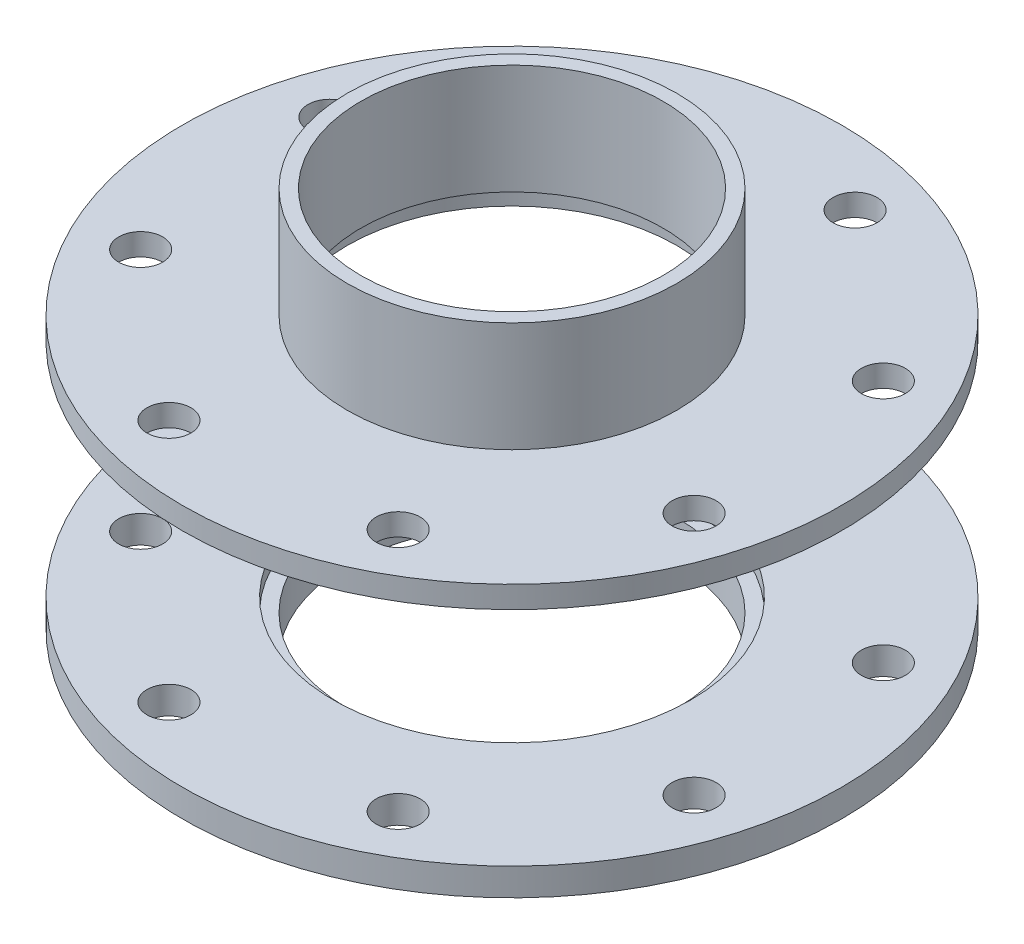
ISO-10303-21;
HEADER;
FILE_DESCRIPTION(('STEP AP214'),'2;1');
FILE_NAME('part.step','',(''),(''),'','','');
FILE_SCHEMA(('AUTOMOTIVE_DESIGN { 1 0 10303 214 1 1 1 1 }'));
ENDSEC;
DATA;
#1=APPLICATION_CONTEXT('core data for automotive mechanical design processes');
#2=APPLICATION_PROTOCOL_DEFINITION('international standard','automotive_design',2000,#1);
#3=PRODUCT_CONTEXT('',#1,'mechanical');
#4=PRODUCT('Part','Part','',(#3));
#5=PRODUCT_RELATED_PRODUCT_CATEGORY('part','',(#4));
#6=PRODUCT_DEFINITION_FORMATION('','',#4);
#7=PRODUCT_DEFINITION_CONTEXT('part definition',#1,'design');
#8=PRODUCT_DEFINITION('design','',#6,#7);
#9=PRODUCT_DEFINITION_SHAPE('','',#8);
#10=(LENGTH_UNIT() NAMED_UNIT(*) SI_UNIT(.MILLI.,.METRE.));
#11=(NAMED_UNIT(*) PLANE_ANGLE_UNIT() SI_UNIT($,.RADIAN.));
#12=(NAMED_UNIT(*) SI_UNIT($,.STERADIAN.) SOLID_ANGLE_UNIT());
#13=UNCERTAINTY_MEASURE_WITH_UNIT(LENGTH_MEASURE(1.E-05),#10,'distance_accuracy_value','');
#14=(GEOMETRIC_REPRESENTATION_CONTEXT(3) GLOBAL_UNCERTAINTY_ASSIGNED_CONTEXT((#13)) GLOBAL_UNIT_ASSIGNED_CONTEXT((#10,
#11,#12)) REPRESENTATION_CONTEXT('',''));
#15=CARTESIAN_POINT('',(0.,0.,0.));
#16=DIRECTION('',(0.,0.,1.));
#17=DIRECTION('',(1.,0.,0.));
#18=AXIS2_PLACEMENT_3D('',#15,#16,#17);
#19=CARTESIAN_POINT('',(187.471383533687,40.,-89.0764021784217));
#20=DIRECTION('',(0.,1.,0.));
#21=DIRECTION('',(0.,0.,1.));
#22=AXIS2_PLACEMENT_3D('',#19,#20,#21);
#23=PLANE('',#22);
#24=CARTESIAN_POINT('',(187.471383533687,40.,-89.0764021784217));
#25=DIRECTION('',(0.,1.,0.));
#26=DIRECTION('',(0.,0.,1.));
#27=AXIS2_PLACEMENT_3D('',#24,#25,#26);
#28=CIRCLE('',#27,60.);
#29=CARTESIAN_POINT('',(187.471383533687,40.,-29.0764021784217));
#30=VERTEX_POINT('',#29);
#31=EDGE_CURVE('E12',#30,#30,#28,.T.);
#32=ORIENTED_EDGE('',*,*,#31,.T.);
#33=EDGE_LOOP('',(#32));
#34=FACE_BOUND('',#33,.T.);
#35=CARTESIAN_POINT('',(187.471383533687,40.,-89.0764021784217));
#36=DIRECTION('',(0.,1.,0.));
#37=DIRECTION('',(0.,0.,1.));
#38=AXIS2_PLACEMENT_3D('',#35,#36,#37);
#39=CIRCLE('',#38,55.);
#40=CARTESIAN_POINT('',(187.471383533687,40.,-34.0764021784217));
#41=VERTEX_POINT('',#40);
#42=EDGE_CURVE('E67',#41,#41,#39,.T.);
#43=ORIENTED_EDGE('',*,*,#42,.F.);
#44=EDGE_LOOP('',(#43));
#45=FACE_BOUND('',#44,.T.);
#46=ADVANCED_FACE('F56',(#34,#45),#23,.T.);
#47=CARTESIAN_POINT('',(187.471383533687,0.,-89.0764021784217));
#48=DIRECTION('',(0.,1.,0.));
#49=DIRECTION('',(0.,0.,1.));
#50=AXIS2_PLACEMENT_3D('',#47,#48,#49);
#51=PLANE('',#50);
#52=CARTESIAN_POINT('',(187.471383533687,0.,-89.0764021784217));
#53=DIRECTION('',(0.,1.,0.));
#54=DIRECTION('',(0.,0.,1.));
#55=AXIS2_PLACEMENT_3D('',#52,#53,#54);
#56=CIRCLE('',#55,60.);
#57=CARTESIAN_POINT('',(187.471383533687,0.,-29.0764021784217));
#58=VERTEX_POINT('',#57);
#59=EDGE_CURVE('E60',#58,#58,#56,.T.);
#60=ORIENTED_EDGE('',*,*,#59,.F.);
#61=EDGE_LOOP('',(#60));
#62=FACE_BOUND('',#61,.T.);
#63=CARTESIAN_POINT('',(187.471383533687,0.,-89.0764021784217));
#64=DIRECTION('',(0.,1.,0.));
#65=DIRECTION('',(0.,0.,1.));
#66=AXIS2_PLACEMENT_3D('',#63,#64,#65);
#67=CIRCLE('',#66,55.);
#68=CARTESIAN_POINT('',(187.471383533687,0.,-34.0764021784217));
#69=VERTEX_POINT('',#68);
#70=EDGE_CURVE('E69',#69,#69,#67,.T.);
#71=ORIENTED_EDGE('',*,*,#70,.T.);
#72=EDGE_LOOP('',(#71));
#73=FACE_BOUND('',#72,.T.);
#74=ADVANCED_FACE('F79',(#62,#73),#51,.F.);
#75=CARTESIAN_POINT('',(187.471383533687,40.,-89.0764021784217));
#76=DIRECTION('',(0.,-1.,0.));
#77=DIRECTION('',(0.,0.,-1.));
#78=AXIS2_PLACEMENT_3D('',#75,#76,#77);
#79=CYLINDRICAL_SURFACE('',#78,60.);
#80=ORIENTED_EDGE('',*,*,#31,.F.);
#81=EDGE_LOOP('',(#80));
#82=FACE_BOUND('',#81,.T.);
#83=ORIENTED_EDGE('',*,*,#59,.T.);
#84=EDGE_LOOP('',(#83));
#85=FACE_BOUND('',#84,.T.);
#86=ADVANCED_FACE('F58',(#82,#85),#79,.T.);
#87=CARTESIAN_POINT('',(187.471383533687,40.,-89.0764021784217));
#88=DIRECTION('',(0.,-1.,0.));
#89=DIRECTION('',(0.,0.,-1.));
#90=AXIS2_PLACEMENT_3D('',#87,#88,#89);
#91=CYLINDRICAL_SURFACE('',#90,55.);
#92=ORIENTED_EDGE('',*,*,#42,.T.);
#93=EDGE_LOOP('',(#92));
#94=FACE_BOUND('',#93,.T.);
#95=ORIENTED_EDGE('',*,*,#70,.F.);
#96=EDGE_LOOP('',(#95));
#97=FACE_BOUND('',#96,.T.);
#98=ADVANCED_FACE('F75',(#94,#97),#91,.F.);
#99=CLOSED_SHELL('',(#46,#74,#86,#98));
#100=MANIFOLD_SOLID_BREP('B2',#99);
#101=CARTESIAN_POINT('',(99.1444375925494,-8.00000000000002,-42.1898303191856));
#102=DIRECTION('',(0.,1.,0.));
#103=DIRECTION('',(0.,0.,1.));
#104=AXIS2_PLACEMENT_3D('',#101,#102,#103);
#105=CYLINDRICAL_SURFACE('',#104,8.00000000000001);
#106=CARTESIAN_POINT('',(99.1444375925494,-8.00000000000002,-42.1898303191856));
#107=DIRECTION('',(0.,1.,0.));
#108=DIRECTION('',(0.,0.,1.));
#109=AXIS2_PLACEMENT_3D('',#106,#107,#108);
#110=CIRCLE('',#109,8.00000000000001);
#111=CARTESIAN_POINT('',(99.1444375925494,-8.00000000000002,-34.1898303191856));
#112=VERTEX_POINT('',#111);
#113=EDGE_CURVE('E133',#112,#112,#110,.T.);
#114=ORIENTED_EDGE('',*,*,#113,.F.);
#115=EDGE_LOOP('',(#114));
#116=FACE_BOUND('',#115,.T.);
#117=CARTESIAN_POINT('',(99.1444375925494,0.,-42.1898303191856));
#118=DIRECTION('',(0.,1.,0.));
#119=DIRECTION('',(0.,0.,1.));
#120=AXIS2_PLACEMENT_3D('',#117,#118,#119);
#121=CIRCLE('',#120,8.00000000000001);
#122=CARTESIAN_POINT('',(99.1444375925494,0.,-34.1898303191856));
#123=VERTEX_POINT('',#122);
#124=EDGE_CURVE('E165',#123,#123,#121,.T.);
#125=ORIENTED_EDGE('',*,*,#124,.T.);
#126=EDGE_LOOP('',(#125));
#127=FACE_BOUND('',#126,.T.);
#128=ADVANCED_FACE('F125',(#116,#127),#105,.F.);
#129=CARTESIAN_POINT('',(187.471383533687,-8.00000000000002,-89.0764021784217));
#130=DIRECTION('',(0.,1.,0.));
#131=DIRECTION('',(0.,0.,1.));
#132=AXIS2_PLACEMENT_3D('',#129,#130,#131);
#133=CYLINDRICAL_SURFACE('',#132,60.);
#134=CARTESIAN_POINT('',(187.471383533687,-8.00000000000002,-89.0764021784217));
#135=DIRECTION('',(0.,1.,0.));
#136=DIRECTION('',(0.,0.,1.));
#137=AXIS2_PLACEMENT_3D('',#134,#135,#136);
#138=CIRCLE('',#137,60.);
#139=CARTESIAN_POINT('',(187.471383533687,-8.00000000000002,-29.0764021784217));
#140=VERTEX_POINT('',#139);
#141=EDGE_CURVE('E138',#140,#140,#138,.T.);
#142=ORIENTED_EDGE('',*,*,#141,.F.);
#143=EDGE_LOOP('',(#142));
#144=FACE_BOUND('',#143,.T.);
#145=CARTESIAN_POINT('',(187.471383533687,0.,-89.0764021784217));
#146=DIRECTION('',(0.,1.,0.));
#147=DIRECTION('',(0.,0.,1.));
#148=AXIS2_PLACEMENT_3D('',#145,#146,#147);
#149=CIRCLE('',#148,60.);
#150=CARTESIAN_POINT('',(187.471383533687,0.,-29.0764021784217));
#151=VERTEX_POINT('',#150);
#152=EDGE_CURVE('E163',#151,#151,#149,.T.);
#153=ORIENTED_EDGE('',*,*,#152,.T.);
#154=EDGE_LOOP('',(#153));
#155=FACE_BOUND('',#154,.T.);
#156=ADVANCED_FACE('F201',(#144,#155),#133,.F.);
#157=CARTESIAN_POINT('',(91.8609881889549,-8.00000000000002,-118.379171706642));
#158=DIRECTION('',(0.,1.,0.));
#159=DIRECTION('',(0.,0.,1.));
#160=AXIS2_PLACEMENT_3D('',#157,#158,#159);
#161=CYLINDRICAL_SURFACE('',#160,8.00000000000001);
#162=CARTESIAN_POINT('',(91.8609881889549,-8.00000000000002,-118.379171706642));
#163=DIRECTION('',(0.,1.,0.));
#164=DIRECTION('',(0.,0.,1.));
#165=AXIS2_PLACEMENT_3D('',#162,#163,#164);
#166=CIRCLE('',#165,8.00000000000001);
#167=CARTESIAN_POINT('',(91.8609881889549,-8.00000000000002,-110.379171706642));
#168=VERTEX_POINT('',#167);
#169=EDGE_CURVE('E193',#168,#168,#166,.T.);
#170=ORIENTED_EDGE('',*,*,#169,.F.);
#171=EDGE_LOOP('',(#170));
#172=FACE_BOUND('',#171,.T.);
#173=CARTESIAN_POINT('',(91.8609881889549,0.,-118.379171706642));
#174=DIRECTION('',(0.,1.,0.));
#175=DIRECTION('',(0.,0.,1.));
#176=AXIS2_PLACEMENT_3D('',#173,#174,#175);
#177=CIRCLE('',#176,8.00000000000001);
#178=CARTESIAN_POINT('',(91.8609881889549,0.,-110.379171706642));
#179=VERTEX_POINT('',#178);
#180=EDGE_CURVE('E160',#179,#179,#177,.T.);
#181=ORIENTED_EDGE('',*,*,#180,.T.);
#182=EDGE_LOOP('',(#181));
#183=FACE_BOUND('',#182,.T.);
#184=ADVANCED_FACE('F204',(#172,#183),#161,.F.);
#185=CARTESIAN_POINT('',(140.584811674451,-8.00000000000002,-177.40334811956));
#186=DIRECTION('',(0.,1.,0.));
#187=DIRECTION('',(0.,0.,1.));
#188=AXIS2_PLACEMENT_3D('',#185,#186,#187);
#189=CYLINDRICAL_SURFACE('',#188,7.99999999999998);
#190=CARTESIAN_POINT('',(140.584811674451,-8.00000000000002,-177.40334811956));
#191=DIRECTION('',(0.,1.,0.));
#192=DIRECTION('',(0.,0.,1.));
#193=AXIS2_PLACEMENT_3D('',#190,#191,#192);
#194=CIRCLE('',#193,7.99999999999998);
#195=CARTESIAN_POINT('',(140.584811674451,-8.00000000000002,-169.40334811956));
#196=VERTEX_POINT('',#195);
#197=EDGE_CURVE('E190',#196,#196,#194,.T.);
#198=ORIENTED_EDGE('',*,*,#197,.F.);
#199=EDGE_LOOP('',(#198));
#200=FACE_BOUND('',#199,.T.);
#201=CARTESIAN_POINT('',(140.584811674451,0.,-177.40334811956));
#202=DIRECTION('',(0.,1.,0.));
#203=DIRECTION('',(0.,0.,1.));
#204=AXIS2_PLACEMENT_3D('',#201,#202,#203);
#205=CIRCLE('',#204,7.99999999999998);
#206=CARTESIAN_POINT('',(140.584811674451,0.,-169.40334811956));
#207=VERTEX_POINT('',#206);
#208=EDGE_CURVE('E157',#207,#207,#205,.T.);
#209=ORIENTED_EDGE('',*,*,#208,.T.);
#210=EDGE_LOOP('',(#209));
#211=FACE_BOUND('',#210,.T.);
#212=ADVANCED_FACE('F230',(#200,#211),#189,.F.);
#213=CARTESIAN_POINT('',(216.774153061908,-8.00000000000002,-184.686797523154));
#214=DIRECTION('',(0.,1.,0.));
#215=DIRECTION('',(0.,0.,1.));
#216=AXIS2_PLACEMENT_3D('',#213,#214,#215);
#217=CYLINDRICAL_SURFACE('',#216,8.00000000000001);
#218=CARTESIAN_POINT('',(216.774153061908,-8.00000000000002,-184.686797523154));
#219=DIRECTION('',(0.,1.,0.));
#220=DIRECTION('',(0.,0.,1.));
#221=AXIS2_PLACEMENT_3D('',#218,#219,#220);
#222=CIRCLE('',#221,8.00000000000001);
#223=CARTESIAN_POINT('',(216.774153061908,-8.00000000000002,-176.686797523154));
#224=VERTEX_POINT('',#223);
#225=EDGE_CURVE('E187',#224,#224,#222,.T.);
#226=ORIENTED_EDGE('',*,*,#225,.F.);
#227=EDGE_LOOP('',(#226));
#228=FACE_BOUND('',#227,.T.);
#229=CARTESIAN_POINT('',(216.774153061908,0.,-184.686797523154));
#230=DIRECTION('',(0.,1.,0.));
#231=DIRECTION('',(0.,0.,1.));
#232=AXIS2_PLACEMENT_3D('',#229,#230,#231);
#233=CIRCLE('',#232,8.00000000000001);
#234=CARTESIAN_POINT('',(216.774153061908,0.,-176.686797523154));
#235=VERTEX_POINT('',#234);
#236=EDGE_CURVE('E154',#235,#235,#233,.T.);
#237=ORIENTED_EDGE('',*,*,#236,.T.);
#238=EDGE_LOOP('',(#237));
#239=FACE_BOUND('',#238,.T.);
#240=ADVANCED_FACE('F234',(#228,#239),#217,.F.);
#241=CARTESIAN_POINT('',(275.798329474825,-8.00000000000002,-135.962974037657));
#242=DIRECTION('',(0.,1.,0.));
#243=DIRECTION('',(0.,0.,1.));
#244=AXIS2_PLACEMENT_3D('',#241,#242,#243);
#245=CYLINDRICAL_SURFACE('',#244,8.00000000000002);
#246=CARTESIAN_POINT('',(275.798329474825,-8.00000000000002,-135.962974037657));
#247=DIRECTION('',(0.,1.,0.));
#248=DIRECTION('',(0.,0.,1.));
#249=AXIS2_PLACEMENT_3D('',#246,#247,#248);
#250=CIRCLE('',#249,8.00000000000002);
#251=CARTESIAN_POINT('',(275.798329474825,-8.00000000000002,-127.962974037657));
#252=VERTEX_POINT('',#251);
#253=EDGE_CURVE('E184',#252,#252,#250,.T.);
#254=ORIENTED_EDGE('',*,*,#253,.F.);
#255=EDGE_LOOP('',(#254));
#256=FACE_BOUND('',#255,.T.);
#257=CARTESIAN_POINT('',(275.798329474825,0.,-135.962974037657));
#258=DIRECTION('',(0.,1.,0.));
#259=DIRECTION('',(0.,0.,1.));
#260=AXIS2_PLACEMENT_3D('',#257,#258,#259);
#261=CIRCLE('',#260,8.00000000000002);
#262=CARTESIAN_POINT('',(275.798329474825,0.,-127.962974037657));
#263=VERTEX_POINT('',#262);
#264=EDGE_CURVE('E151',#263,#263,#261,.T.);
#265=ORIENTED_EDGE('',*,*,#264,.T.);
#266=EDGE_LOOP('',(#265));
#267=FACE_BOUND('',#266,.T.);
#268=ADVANCED_FACE('F238',(#256,#267),#245,.F.);
#269=CARTESIAN_POINT('',(283.081778878419,-8.00000000000002,-59.773632650201));
#270=DIRECTION('',(0.,1.,0.));
#271=DIRECTION('',(0.,0.,1.));
#272=AXIS2_PLACEMENT_3D('',#269,#270,#271);
#273=CYLINDRICAL_SURFACE('',#272,8.00000000000001);
#274=CARTESIAN_POINT('',(283.081778878419,-8.00000000000002,-59.773632650201));
#275=DIRECTION('',(0.,1.,0.));
#276=DIRECTION('',(0.,0.,1.));
#277=AXIS2_PLACEMENT_3D('',#274,#275,#276);
#278=CIRCLE('',#277,8.00000000000001);
#279=CARTESIAN_POINT('',(283.081778878419,-8.00000000000002,-51.773632650201));
#280=VERTEX_POINT('',#279);
#281=EDGE_CURVE('E179',#280,#280,#278,.T.);
#282=ORIENTED_EDGE('',*,*,#281,.F.);
#283=EDGE_LOOP('',(#282));
#284=FACE_BOUND('',#283,.T.);
#285=CARTESIAN_POINT('',(283.081778878419,0.,-59.773632650201));
#286=DIRECTION('',(0.,1.,0.));
#287=DIRECTION('',(0.,0.,1.));
#288=AXIS2_PLACEMENT_3D('',#285,#286,#287);
#289=CIRCLE('',#288,8.00000000000001);
#290=CARTESIAN_POINT('',(283.081778878419,0.,-51.773632650201));
#291=VERTEX_POINT('',#290);
#292=EDGE_CURVE('E148',#291,#291,#289,.T.);
#293=ORIENTED_EDGE('',*,*,#292,.T.);
#294=EDGE_LOOP('',(#293));
#295=FACE_BOUND('',#294,.T.);
#296=ADVANCED_FACE('F242',(#284,#295),#273,.F.);
#297=CARTESIAN_POINT('',(234.357955392922,-8.00000000000002,-0.749456237283397));
#298=DIRECTION('',(0.,1.,0.));
#299=DIRECTION('',(0.,0.,1.));
#300=AXIS2_PLACEMENT_3D('',#297,#298,#299);
#301=CYLINDRICAL_SURFACE('',#300,8.00000000000001);
#302=CARTESIAN_POINT('',(234.357955392922,-8.00000000000002,-0.749456237283397));
#303=DIRECTION('',(0.,1.,0.));
#304=DIRECTION('',(0.,0.,1.));
#305=AXIS2_PLACEMENT_3D('',#302,#303,#304);
#306=CIRCLE('',#305,8.00000000000001);
#307=CARTESIAN_POINT('',(234.357955392922,-8.00000000000002,7.25054376271661));
#308=VERTEX_POINT('',#307);
#309=EDGE_CURVE('E174',#308,#308,#306,.T.);
#310=ORIENTED_EDGE('',*,*,#309,.F.);
#311=EDGE_LOOP('',(#310));
#312=FACE_BOUND('',#311,.T.);
#313=CARTESIAN_POINT('',(234.357955392922,0.,-0.749456237283397));
#314=DIRECTION('',(0.,1.,0.));
#315=DIRECTION('',(0.,0.,1.));
#316=AXIS2_PLACEMENT_3D('',#313,#314,#315);
#317=CIRCLE('',#316,8.00000000000001);
#318=CARTESIAN_POINT('',(234.357955392922,0.,7.25054376271661));
#319=VERTEX_POINT('',#318);
#320=EDGE_CURVE('E145',#319,#319,#317,.T.);
#321=ORIENTED_EDGE('',*,*,#320,.T.);
#322=EDGE_LOOP('',(#321));
#323=FACE_BOUND('',#322,.T.);
#324=ADVANCED_FACE('F245',(#312,#323),#301,.F.);
#325=CARTESIAN_POINT('',(158.168614005466,-8.00000000000002,6.53399316631029));
#326=DIRECTION('',(0.,1.,0.));
#327=DIRECTION('',(0.,0.,1.));
#328=AXIS2_PLACEMENT_3D('',#325,#326,#327);
#329=CYLINDRICAL_SURFACE('',#328,8.);
#330=CARTESIAN_POINT('',(158.168614005466,-8.00000000000002,6.53399316631029));
#331=DIRECTION('',(0.,1.,0.));
#332=DIRECTION('',(0.,0.,1.));
#333=AXIS2_PLACEMENT_3D('',#330,#331,#332);
#334=CIRCLE('',#333,8.);
#335=CARTESIAN_POINT('',(158.168614005466,-8.00000000000002,14.5339931663103));
#336=VERTEX_POINT('',#335);
#337=EDGE_CURVE('E170',#336,#336,#334,.T.);
#338=ORIENTED_EDGE('',*,*,#337,.F.);
#339=EDGE_LOOP('',(#338));
#340=FACE_BOUND('',#339,.T.);
#341=CARTESIAN_POINT('',(158.168614005466,0.,6.53399316631029));
#342=DIRECTION('',(0.,1.,0.));
#343=DIRECTION('',(0.,0.,1.));
#344=AXIS2_PLACEMENT_3D('',#341,#342,#343);
#345=CIRCLE('',#344,8.);
#346=CARTESIAN_POINT('',(158.168614005466,0.,14.5339931663103));
#347=VERTEX_POINT('',#346);
#348=EDGE_CURVE('E142',#347,#347,#345,.T.);
#349=ORIENTED_EDGE('',*,*,#348,.T.);
#350=EDGE_LOOP('',(#349));
#351=FACE_BOUND('',#350,.T.);
#352=ADVANCED_FACE('F127',(#340,#351),#329,.F.);
#353=CARTESIAN_POINT('',(187.471383533687,-8.00000000000002,-89.0764021784217));
#354=DIRECTION('',(0.,1.,0.));
#355=DIRECTION('',(0.,0.,1.));
#356=AXIS2_PLACEMENT_3D('',#353,#354,#355);
#357=CYLINDRICAL_SURFACE('',#356,120.);
#358=CARTESIAN_POINT('',(187.471383533687,-8.00000000000002,-89.0764021784217));
#359=DIRECTION('',(0.,1.,0.));
#360=DIRECTION('',(0.,0.,1.));
#361=AXIS2_PLACEMENT_3D('',#358,#359,#360);
#362=CIRCLE('',#361,120.);
#363=CARTESIAN_POINT('',(187.471383533687,-8.00000000000002,30.9235978215783));
#364=VERTEX_POINT('',#363);
#365=EDGE_CURVE('E55',#364,#364,#362,.T.);
#366=ORIENTED_EDGE('',*,*,#365,.T.);
#367=EDGE_LOOP('',(#366));
#368=FACE_BOUND('',#367,.T.);
#369=CARTESIAN_POINT('',(187.471383533687,0.,-89.0764021784217));
#370=DIRECTION('',(0.,1.,0.));
#371=DIRECTION('',(0.,0.,1.));
#372=AXIS2_PLACEMENT_3D('',#369,#370,#371);
#373=CIRCLE('',#372,120.);
#374=CARTESIAN_POINT('',(187.471383533687,0.,30.9235978215783));
#375=VERTEX_POINT('',#374);
#376=EDGE_CURVE('E129',#375,#375,#373,.T.);
#377=ORIENTED_EDGE('',*,*,#376,.F.);
#378=EDGE_LOOP('',(#377));
#379=FACE_BOUND('',#378,.T.);
#380=ADVANCED_FACE('F216',(#368,#379),#357,.T.);
#381=CARTESIAN_POINT('',(0.,-8.00000000000002,0.));
#382=DIRECTION('',(0.,1.,0.));
#383=DIRECTION('',(0.,0.,1.));
#384=AXIS2_PLACEMENT_3D('',#381,#382,#383);
#385=PLANE('',#384);
#386=ORIENTED_EDGE('',*,*,#337,.T.);
#387=EDGE_LOOP('',(#386));
#388=FACE_BOUND('',#387,.T.);
#389=ORIENTED_EDGE('',*,*,#309,.T.);
#390=EDGE_LOOP('',(#389));
#391=FACE_BOUND('',#390,.T.);
#392=ORIENTED_EDGE('',*,*,#281,.T.);
#393=EDGE_LOOP('',(#392));
#394=FACE_BOUND('',#393,.T.);
#395=ORIENTED_EDGE('',*,*,#253,.T.);
#396=EDGE_LOOP('',(#395));
#397=FACE_BOUND('',#396,.T.);
#398=ORIENTED_EDGE('',*,*,#225,.T.);
#399=EDGE_LOOP('',(#398));
#400=FACE_BOUND('',#399,.T.);
#401=ORIENTED_EDGE('',*,*,#197,.T.);
#402=EDGE_LOOP('',(#401));
#403=FACE_BOUND('',#402,.T.);
#404=ORIENTED_EDGE('',*,*,#169,.T.);
#405=EDGE_LOOP('',(#404));
#406=FACE_BOUND('',#405,.T.);
#407=ORIENTED_EDGE('',*,*,#141,.T.);
#408=EDGE_LOOP('',(#407));
#409=FACE_BOUND('',#408,.T.);
#410=ORIENTED_EDGE('',*,*,#113,.T.);
#411=EDGE_LOOP('',(#410));
#412=FACE_BOUND('',#411,.T.);
#413=ORIENTED_EDGE('',*,*,#365,.F.);
#414=EDGE_LOOP('',(#413));
#415=FACE_BOUND('',#414,.T.);
#416=ADVANCED_FACE('F198',(#388,#391,#394,#397,#400,#403,#406,#409,#412,#415),#385,.F.);
#417=CARTESIAN_POINT('',(0.,0.,0.));
#418=DIRECTION('',(0.,1.,0.));
#419=DIRECTION('',(0.,0.,1.));
#420=AXIS2_PLACEMENT_3D('',#417,#418,#419);
#421=PLANE('',#420);
#422=ORIENTED_EDGE('',*,*,#348,.F.);
#423=EDGE_LOOP('',(#422));
#424=FACE_BOUND('',#423,.T.);
#425=ORIENTED_EDGE('',*,*,#320,.F.);
#426=EDGE_LOOP('',(#425));
#427=FACE_BOUND('',#426,.T.);
#428=ORIENTED_EDGE('',*,*,#292,.F.);
#429=EDGE_LOOP('',(#428));
#430=FACE_BOUND('',#429,.T.);
#431=ORIENTED_EDGE('',*,*,#264,.F.);
#432=EDGE_LOOP('',(#431));
#433=FACE_BOUND('',#432,.T.);
#434=ORIENTED_EDGE('',*,*,#236,.F.);
#435=EDGE_LOOP('',(#434));
#436=FACE_BOUND('',#435,.T.);
#437=ORIENTED_EDGE('',*,*,#208,.F.);
#438=EDGE_LOOP('',(#437));
#439=FACE_BOUND('',#438,.T.);
#440=ORIENTED_EDGE('',*,*,#180,.F.);
#441=EDGE_LOOP('',(#440));
#442=FACE_BOUND('',#441,.T.);
#443=ORIENTED_EDGE('',*,*,#152,.F.);
#444=EDGE_LOOP('',(#443));
#445=FACE_BOUND('',#444,.T.);
#446=ORIENTED_EDGE('',*,*,#124,.F.);
#447=EDGE_LOOP('',(#446));
#448=FACE_BOUND('',#447,.T.);
#449=ORIENTED_EDGE('',*,*,#376,.T.);
#450=EDGE_LOOP('',(#449));
#451=FACE_BOUND('',#450,.T.);
#452=ADVANCED_FACE('F208',(#424,#427,#430,#433,#436,#439,#442,#445,#448,#451),#421,.T.);
#453=CLOSED_SHELL('',(#128,#156,#184,#212,#240,#268,#296,#324,#352,#380,#416,#452));
#454=MANIFOLD_SOLID_BREP('B7',#453);
#455=CARTESIAN_POINT('',(187.471383533687,-67.4794675454199,-89.0764021784217));
#456=DIRECTION('',(0.,1.,0.));
#457=DIRECTION('',(-1.,0.,0.));
#458=AXIS2_PLACEMENT_3D('',#455,#456,#457);
#459=CYLINDRICAL_SURFACE('',#458,120.);
#460=CARTESIAN_POINT('',(187.471383533687,-88.8700382614864,-89.0764021784217));
#461=DIRECTION('',(0.,1.,0.));
#462=DIRECTION('',(-1.,0.,0.));
#463=AXIS2_PLACEMENT_3D('',#460,#461,#462);
#464=CIRCLE('',#463,120.);
#465=CARTESIAN_POINT('',(67.4713835336872,-88.8700382614864,-89.0764021784217));
#466=VERTEX_POINT('',#465);
#467=EDGE_CURVE('E124',#466,#466,#464,.T.);
#468=ORIENTED_EDGE('',*,*,#467,.F.);
#469=EDGE_LOOP('',(#468));
#470=FACE_BOUND('',#469,.T.);
#471=CARTESIAN_POINT('',(187.471383533687,-98.8700382614864,-89.0764021784217));
#472=DIRECTION('',(0.,1.,0.));
#473=DIRECTION('',(-1.,0.,0.));
#474=AXIS2_PLACEMENT_3D('',#471,#472,#473);
#475=CIRCLE('',#474,120.);
#476=CARTESIAN_POINT('',(67.4713835336873,-98.8700382614864,-89.0764021784217));
#477=VERTEX_POINT('',#476);
#478=EDGE_CURVE('E377',#477,#477,#475,.T.);
#479=ORIENTED_EDGE('',*,*,#478,.T.);
#480=EDGE_LOOP('',(#479));
#481=FACE_BOUND('',#480,.T.);
#482=ADVANCED_FACE('F355',(#470,#481),#459,.T.);
#483=CARTESIAN_POINT('',(252.471383533687,-88.8700382614864,-89.0764021784217));
#484=DIRECTION('',(0.,-1.,0.));
#485=DIRECTION('',(1.,0.,0.));
#486=AXIS2_PLACEMENT_3D('',#483,#484,#485);
#487=PLANE('',#486);
#488=CARTESIAN_POINT('',(140.584811674451,-88.8700382614864,-177.40334811956));
#489=DIRECTION('',(0.,1.,0.));
#490=DIRECTION('',(0.,0.,-1.));
#491=AXIS2_PLACEMENT_3D('',#488,#489,#490);
#492=CIRCLE('',#491,8.00000000000001);
#493=CARTESIAN_POINT('',(140.584811674451,-88.8700382614864,-185.40334811956));
#494=VERTEX_POINT('',#493);
#495=EDGE_CURVE('E389',#494,#494,#492,.T.);
#496=ORIENTED_EDGE('',*,*,#495,.F.);
#497=EDGE_LOOP('',(#496));
#498=FACE_BOUND('',#497,.T.);
#499=CARTESIAN_POINT('',(216.774153061908,-88.8700382614864,-184.686797523154));
#500=DIRECTION('',(0.,1.,0.));
#501=DIRECTION('',(0.707106781186551,0.,-0.707106781186544));
#502=AXIS2_PLACEMENT_3D('',#499,#500,#501);
#503=CIRCLE('',#502,8.00000000000001);
#504=CARTESIAN_POINT('',(222.4310073114,-88.8700382614864,-190.343651772646));
#505=VERTEX_POINT('',#504);
#506=EDGE_CURVE('E522',#505,#505,#503,.T.);
#507=ORIENTED_EDGE('',*,*,#506,.F.);
#508=EDGE_LOOP('',(#507));
#509=FACE_BOUND('',#508,.T.);
#510=CARTESIAN_POINT('',(275.798329474825,-88.8700382614863,-135.962974037657));
#511=DIRECTION('',(0.,1.,0.));
#512=DIRECTION('',(1.,0.,0.));
#513=AXIS2_PLACEMENT_3D('',#510,#511,#512);
#514=CIRCLE('',#513,8.00000000000001);
#515=CARTESIAN_POINT('',(283.798329474825,-88.8700382614863,-135.962974037657));
#516=VERTEX_POINT('',#515);
#517=EDGE_CURVE('E526',#516,#516,#514,.T.);
#518=ORIENTED_EDGE('',*,*,#517,.F.);
#519=EDGE_LOOP('',(#518));
#520=FACE_BOUND('',#519,.T.);
#521=CARTESIAN_POINT('',(283.081778878419,-88.8700382614864,-59.773632650201));
#522=DIRECTION('',(0.,1.,0.));
#523=DIRECTION('',(0.707106781186541,0.,0.707106781186554));
#524=AXIS2_PLACEMENT_3D('',#521,#522,#523);
#525=CIRCLE('',#524,8.00000000000001);
#526=CARTESIAN_POINT('',(288.738633127912,-88.8700382614864,-54.1167784007085));
#527=VERTEX_POINT('',#526);
#528=EDGE_CURVE('E532',#527,#527,#525,.T.);
#529=ORIENTED_EDGE('',*,*,#528,.F.);
#530=EDGE_LOOP('',(#529));
#531=FACE_BOUND('',#530,.T.);
#532=CARTESIAN_POINT('',(234.357955392922,-88.8700382614864,-0.749456237283383));
#533=DIRECTION('',(0.,1.,0.));
#534=DIRECTION('',(0.,0.,1.));
#535=AXIS2_PLACEMENT_3D('',#532,#533,#534);
#536=CIRCLE('',#535,8.00000000000001);
#537=CARTESIAN_POINT('',(234.357955392922,-88.8700382614864,7.25054376271663));
#538=VERTEX_POINT('',#537);
#539=EDGE_CURVE('E535',#538,#538,#536,.T.);
#540=ORIENTED_EDGE('',*,*,#539,.F.);
#541=EDGE_LOOP('',(#540));
#542=FACE_BOUND('',#541,.T.);
#543=CARTESIAN_POINT('',(158.168614005466,-88.8700382614864,6.5339931663103));
#544=DIRECTION('',(0.,1.,0.));
#545=DIRECTION('',(-0.707106781186556,0.,0.707106781186539));
#546=AXIS2_PLACEMENT_3D('',#543,#544,#545);
#547=CIRCLE('',#546,8.00000000000001);
#548=CARTESIAN_POINT('',(152.511759755974,-88.8700382614864,12.1908474158026));
#549=VERTEX_POINT('',#548);
#550=EDGE_CURVE('E416',#549,#549,#547,.T.);
#551=ORIENTED_EDGE('',*,*,#550,.F.);
#552=EDGE_LOOP('',(#551));
#553=FACE_BOUND('',#552,.T.);
#554=CARTESIAN_POINT('',(91.8609881889549,-88.8700382614864,-118.379171706642));
#555=DIRECTION('',(0.,1.,0.));
#556=DIRECTION('',(-0.707106781186546,0.,-0.707106781186549));
#557=AXIS2_PLACEMENT_3D('',#554,#555,#556);
#558=CIRCLE('',#557,8.00000000000001);
#559=CARTESIAN_POINT('',(86.2041339394625,-88.8700382614864,-124.036025956134));
#560=VERTEX_POINT('',#559);
#561=EDGE_CURVE('E383',#560,#560,#558,.T.);
#562=ORIENTED_EDGE('',*,*,#561,.F.);
#563=EDGE_LOOP('',(#562));
#564=FACE_BOUND('',#563,.T.);
#565=CARTESIAN_POINT('',(99.1444375925494,-88.8700382614864,-42.1898303191856));
#566=DIRECTION('',(0.,1.,0.));
#567=DIRECTION('',(-1.,0.,0.));
#568=AXIS2_PLACEMENT_3D('',#565,#566,#567);
#569=CIRCLE('',#568,8.00000000000001);
#570=CARTESIAN_POINT('',(91.1444375925494,-88.8700382614864,-42.1898303191856));
#571=VERTEX_POINT('',#570);
#572=EDGE_CURVE('E378',#571,#571,#569,.T.);
#573=ORIENTED_EDGE('',*,*,#572,.F.);
#574=EDGE_LOOP('',(#573));
#575=FACE_BOUND('',#574,.T.);
#576=CARTESIAN_POINT('',(187.471383533687,-88.8700382614864,-89.0764021784217));
#577=DIRECTION('',(0.,1.,0.));
#578=DIRECTION('',(-1.,0.,0.));
#579=AXIS2_PLACEMENT_3D('',#576,#577,#578);
#580=CIRCLE('',#579,65.);
#581=CARTESIAN_POINT('',(122.471383533687,-88.8700382614864,-89.0764021784217));
#582=VERTEX_POINT('',#581);
#583=EDGE_CURVE('E363',#582,#582,#580,.T.);
#584=ORIENTED_EDGE('',*,*,#583,.F.);
#585=EDGE_LOOP('',(#584));
#586=FACE_BOUND('',#585,.T.);
#587=ORIENTED_EDGE('',*,*,#467,.T.);
#588=EDGE_LOOP('',(#587));
#589=FACE_BOUND('',#588,.T.);
#590=ADVANCED_FACE('F452',(#498,#509,#520,#531,#542,#553,#564,#575,#586,#589),#487,.F.);
#591=CARTESIAN_POINT('',(187.471383533687,-67.4794675454199,-89.0764021784217));
#592=DIRECTION('',(0.,1.,0.));
#593=DIRECTION('',(-1.,0.,0.));
#594=AXIS2_PLACEMENT_3D('',#591,#592,#593);
#595=CYLINDRICAL_SURFACE('',#594,65.);
#596=CARTESIAN_POINT('',(187.471383533687,-93.8700382614864,-89.0764021784217));
#597=DIRECTION('',(0.,1.,0.));
#598=DIRECTION('',(-1.,0.,0.));
#599=AXIS2_PLACEMENT_3D('',#596,#597,#598);
#600=CIRCLE('',#599,65.);
#601=CARTESIAN_POINT('',(122.471383533687,-93.8700382614864,-89.0764021784217));
#602=VERTEX_POINT('',#601);
#603=EDGE_CURVE('E369',#602,#602,#600,.T.);
#604=ORIENTED_EDGE('',*,*,#603,.F.);
#605=EDGE_LOOP('',(#604));
#606=FACE_BOUND('',#605,.T.);
#607=ORIENTED_EDGE('',*,*,#583,.T.);
#608=EDGE_LOOP('',(#607));
#609=FACE_BOUND('',#608,.T.);
#610=ADVANCED_FACE('F449',(#606,#609),#595,.F.);
#611=CARTESIAN_POINT('',(252.471383533687,-93.8700382614864,-89.0764021784217));
#612=DIRECTION('',(0.,-1.,0.));
#613=DIRECTION('',(1.,0.,0.));
#614=AXIS2_PLACEMENT_3D('',#611,#612,#613);
#615=PLANE('',#614);
#616=CARTESIAN_POINT('',(187.471383533687,-93.8700382614864,-89.0764021784217));
#617=DIRECTION('',(0.,1.,0.));
#618=DIRECTION('',(-1.,0.,0.));
#619=AXIS2_PLACEMENT_3D('',#616,#617,#618);
#620=CIRCLE('',#619,60.);
#621=CARTESIAN_POINT('',(127.471383533687,-93.8700382614864,-89.0764021784217));
#622=VERTEX_POINT('',#621);
#623=EDGE_CURVE('E440',#622,#622,#620,.T.);
#624=ORIENTED_EDGE('',*,*,#623,.F.);
#625=EDGE_LOOP('',(#624));
#626=FACE_BOUND('',#625,.T.);
#627=ORIENTED_EDGE('',*,*,#603,.T.);
#628=EDGE_LOOP('',(#627));
#629=FACE_BOUND('',#628,.T.);
#630=ADVANCED_FACE('F447',(#626,#629),#615,.F.);
#631=CARTESIAN_POINT('',(187.471383533687,-67.4794675454199,-89.0764021784217));
#632=DIRECTION('',(0.,1.,0.));
#633=DIRECTION('',(-1.,0.,0.));
#634=AXIS2_PLACEMENT_3D('',#631,#632,#633);
#635=CYLINDRICAL_SURFACE('',#634,60.);
#636=CARTESIAN_POINT('',(187.471383533687,-108.870038261486,-89.0764021784217));
#637=DIRECTION('',(0.,1.,0.));
#638=DIRECTION('',(-1.,0.,0.));
#639=AXIS2_PLACEMENT_3D('',#636,#637,#638);
#640=CIRCLE('',#639,60.);
#641=CARTESIAN_POINT('',(127.471383533687,-108.870038261486,-89.0764021784217));
#642=VERTEX_POINT('',#641);
#643=EDGE_CURVE('E436',#642,#642,#640,.T.);
#644=ORIENTED_EDGE('',*,*,#643,.F.);
#645=EDGE_LOOP('',(#644));
#646=FACE_BOUND('',#645,.T.);
#647=ORIENTED_EDGE('',*,*,#623,.T.);
#648=EDGE_LOOP('',(#647));
#649=FACE_BOUND('',#648,.T.);
#650=ADVANCED_FACE('F467',(#646,#649),#635,.F.);
#651=CARTESIAN_POINT('',(257.471383533687,-108.870038261486,-89.0764021784217));
#652=DIRECTION('',(0.,1.,0.));
#653=DIRECTION('',(-1.,0.,0.));
#654=AXIS2_PLACEMENT_3D('',#651,#652,#653);
#655=PLANE('',#654);
#656=CARTESIAN_POINT('',(187.471383533687,-108.870038261486,-89.0764021784217));
#657=DIRECTION('',(0.,1.,0.));
#658=DIRECTION('',(-1.,0.,0.));
#659=AXIS2_PLACEMENT_3D('',#656,#657,#658);
#660=CIRCLE('',#659,70.);
#661=CARTESIAN_POINT('',(117.471383533687,-108.870038261486,-89.0764021784217));
#662=VERTEX_POINT('',#661);
#663=EDGE_CURVE('E432',#662,#662,#660,.T.);
#664=ORIENTED_EDGE('',*,*,#663,.F.);
#665=EDGE_LOOP('',(#664));
#666=FACE_BOUND('',#665,.T.);
#667=ORIENTED_EDGE('',*,*,#643,.T.);
#668=EDGE_LOOP('',(#667));
#669=FACE_BOUND('',#668,.T.);
#670=ADVANCED_FACE('F471',(#666,#669),#655,.F.);
#671=CARTESIAN_POINT('',(187.471383533687,-67.4794675454199,-89.0764021784217));
#672=DIRECTION('',(0.,1.,0.));
#673=DIRECTION('',(-1.,0.,0.));
#674=AXIS2_PLACEMENT_3D('',#671,#672,#673);
#675=CYLINDRICAL_SURFACE('',#674,70.);
#676=CARTESIAN_POINT('',(187.471383533687,-103.870038261486,-89.0764021784217));
#677=DIRECTION('',(0.,1.,0.));
#678=DIRECTION('',(-1.,0.,0.));
#679=AXIS2_PLACEMENT_3D('',#676,#677,#678);
#680=CIRCLE('',#679,70.);
#681=CARTESIAN_POINT('',(117.471383533687,-103.870038261486,-89.0764021784217));
#682=VERTEX_POINT('',#681);
#683=EDGE_CURVE('E428',#682,#682,#680,.T.);
#684=ORIENTED_EDGE('',*,*,#683,.F.);
#685=EDGE_LOOP('',(#684));
#686=FACE_BOUND('',#685,.T.);
#687=ORIENTED_EDGE('',*,*,#663,.T.);
#688=EDGE_LOOP('',(#687));
#689=FACE_BOUND('',#688,.T.);
#690=ADVANCED_FACE('F475',(#686,#689),#675,.T.);
#691=CARTESIAN_POINT('',(187.471383533687,-103.870038261486,-89.0764021784217));
#692=DIRECTION('',(0.,1.,0.));
#693=DIRECTION('',(-1.,0.,0.));
#694=AXIS2_PLACEMENT_3D('',#691,#692,#693);
#695=TOROIDAL_SURFACE('',#694,75.,5.);
#696=CARTESIAN_POINT('',(187.471383533687,-98.8700382614864,-89.0764021784217));
#697=DIRECTION('',(0.,1.,0.));
#698=DIRECTION('',(-1.,0.,0.));
#699=AXIS2_PLACEMENT_3D('',#696,#697,#698);
#700=CIRCLE('',#699,75.);
#701=CARTESIAN_POINT('',(112.471383533687,-98.8700382614864,-89.0764021784217));
#702=VERTEX_POINT('',#701);
#703=EDGE_CURVE('E424',#702,#702,#700,.T.);
#704=ORIENTED_EDGE('',*,*,#703,.F.);
#705=EDGE_LOOP('',(#704));
#706=FACE_BOUND('',#705,.T.);
#707=ORIENTED_EDGE('',*,*,#683,.T.);
#708=EDGE_LOOP('',(#707));
#709=FACE_BOUND('',#708,.T.);
#710=ADVANCED_FACE('F479',(#706,#709),#695,.F.);
#711=CARTESIAN_POINT('',(307.471383533687,-98.8700382614864,-89.0764021784217));
#712=DIRECTION('',(0.,1.,0.));
#713=DIRECTION('',(-1.,0.,0.));
#714=AXIS2_PLACEMENT_3D('',#711,#712,#713);
#715=PLANE('',#714);
#716=CARTESIAN_POINT('',(140.584811674451,-98.8700382614864,-177.40334811956));
#717=DIRECTION('',(0.,1.,0.));
#718=DIRECTION('',(-1.,0.,0.));
#719=AXIS2_PLACEMENT_3D('',#716,#717,#718);
#720=CIRCLE('',#719,8.00000000000001);
#721=CARTESIAN_POINT('',(132.584811674451,-98.8700382614864,-177.40334811956));
#722=VERTEX_POINT('',#721);
#723=EDGE_CURVE('E358',#722,#722,#720,.T.);
#724=ORIENTED_EDGE('',*,*,#723,.T.);
#725=EDGE_LOOP('',(#724));
#726=FACE_BOUND('',#725,.T.);
#727=CARTESIAN_POINT('',(216.774153061908,-98.8700382614864,-184.686797523154));
#728=DIRECTION('',(0.,1.,0.));
#729=DIRECTION('',(-1.,0.,0.));
#730=AXIS2_PLACEMENT_3D('',#727,#728,#729);
#731=CIRCLE('',#730,8.00000000000001);
#732=CARTESIAN_POINT('',(208.774153061908,-98.8700382614864,-184.686797523154));
#733=VERTEX_POINT('',#732);
#734=EDGE_CURVE('E400',#733,#733,#731,.T.);
#735=ORIENTED_EDGE('',*,*,#734,.T.);
#736=EDGE_LOOP('',(#735));
#737=FACE_BOUND('',#736,.T.);
#738=CARTESIAN_POINT('',(275.798329474825,-98.8700382614864,-135.962974037657));
#739=DIRECTION('',(0.,1.,0.));
#740=DIRECTION('',(-1.,0.,0.));
#741=AXIS2_PLACEMENT_3D('',#738,#739,#740);
#742=CIRCLE('',#741,8.00000000000001);
#743=CARTESIAN_POINT('',(267.798329474825,-98.8700382614864,-135.962974037657));
#744=VERTEX_POINT('',#743);
#745=EDGE_CURVE('E397',#744,#744,#742,.T.);
#746=ORIENTED_EDGE('',*,*,#745,.T.);
#747=EDGE_LOOP('',(#746));
#748=FACE_BOUND('',#747,.T.);
#749=CARTESIAN_POINT('',(283.081778878419,-98.8700382614864,-59.773632650201));
#750=DIRECTION('',(0.,1.,0.));
#751=DIRECTION('',(-1.,0.,0.));
#752=AXIS2_PLACEMENT_3D('',#749,#750,#751);
#753=CIRCLE('',#752,8.00000000000001);
#754=CARTESIAN_POINT('',(275.081778878419,-98.8700382614864,-59.773632650201));
#755=VERTEX_POINT('',#754);
#756=EDGE_CURVE('E393',#755,#755,#753,.T.);
#757=ORIENTED_EDGE('',*,*,#756,.T.);
#758=EDGE_LOOP('',(#757));
#759=FACE_BOUND('',#758,.T.);
#760=CARTESIAN_POINT('',(234.357955392922,-98.8700382614864,-0.749456237283383));
#761=DIRECTION('',(0.,1.,0.));
#762=DIRECTION('',(-1.,0.,0.));
#763=AXIS2_PLACEMENT_3D('',#760,#761,#762);
#764=CIRCLE('',#763,8.00000000000001);
#765=CARTESIAN_POINT('',(226.357955392922,-98.8700382614864,-0.749456237283383));
#766=VERTEX_POINT('',#765);
#767=EDGE_CURVE('E388',#766,#766,#764,.T.);
#768=ORIENTED_EDGE('',*,*,#767,.T.);
#769=EDGE_LOOP('',(#768));
#770=FACE_BOUND('',#769,.T.);
#771=CARTESIAN_POINT('',(158.168614005466,-98.8700382614864,6.5339931663103));
#772=DIRECTION('',(0.,1.,0.));
#773=DIRECTION('',(-1.,0.,0.));
#774=AXIS2_PLACEMENT_3D('',#771,#772,#773);
#775=CIRCLE('',#774,8.00000000000001);
#776=CARTESIAN_POINT('',(150.168614005466,-98.8700382614864,6.5339931663103));
#777=VERTEX_POINT('',#776);
#778=EDGE_CURVE('E384',#777,#777,#775,.T.);
#779=ORIENTED_EDGE('',*,*,#778,.T.);
#780=EDGE_LOOP('',(#779));
#781=FACE_BOUND('',#780,.T.);
#782=CARTESIAN_POINT('',(91.8609881889549,-98.8700382614864,-118.379171706642));
#783=DIRECTION('',(0.,1.,0.));
#784=DIRECTION('',(-1.,0.,0.));
#785=AXIS2_PLACEMENT_3D('',#782,#783,#784);
#786=CIRCLE('',#785,8.00000000000001);
#787=CARTESIAN_POINT('',(83.8609881889549,-98.8700382614864,-118.379171706642));
#788=VERTEX_POINT('',#787);
#789=EDGE_CURVE('E379',#788,#788,#786,.T.);
#790=ORIENTED_EDGE('',*,*,#789,.T.);
#791=EDGE_LOOP('',(#790));
#792=FACE_BOUND('',#791,.T.);
#793=CARTESIAN_POINT('',(99.1444375925494,-98.8700382614864,-42.1898303191856));
#794=DIRECTION('',(0.,1.,0.));
#795=DIRECTION('',(-1.,0.,0.));
#796=AXIS2_PLACEMENT_3D('',#793,#794,#795);
#797=CIRCLE('',#796,8.00000000000001);
#798=CARTESIAN_POINT('',(91.1444375925494,-98.8700382614864,-42.1898303191856));
#799=VERTEX_POINT('',#798);
#800=EDGE_CURVE('E373',#799,#799,#797,.T.);
#801=ORIENTED_EDGE('',*,*,#800,.T.);
#802=EDGE_LOOP('',(#801));
#803=FACE_BOUND('',#802,.T.);
#804=ORIENTED_EDGE('',*,*,#478,.F.);
#805=EDGE_LOOP('',(#804));
#806=FACE_BOUND('',#805,.T.);
#807=ORIENTED_EDGE('',*,*,#703,.T.);
#808=EDGE_LOOP('',(#807));
#809=FACE_BOUND('',#808,.T.);
#810=ADVANCED_FACE('F483',(#726,#737,#748,#759,#770,#781,#792,#803,#806,#809),#715,.F.);
#811=CARTESIAN_POINT('',(99.1444375925494,-108.870038261486,-42.1898303191856));
#812=DIRECTION('',(0.,1.,0.));
#813=DIRECTION('',(-1.,0.,0.));
#814=AXIS2_PLACEMENT_3D('',#811,#812,#813);
#815=CYLINDRICAL_SURFACE('',#814,8.00000000000001);
#816=ORIENTED_EDGE('',*,*,#572,.T.);
#817=EDGE_LOOP('',(#816));
#818=FACE_BOUND('',#817,.T.);
#819=ORIENTED_EDGE('',*,*,#800,.F.);
#820=EDGE_LOOP('',(#819));
#821=FACE_BOUND('',#820,.T.);
#822=ADVANCED_FACE('F487',(#818,#821),#815,.F.);
#823=CARTESIAN_POINT('',(91.8609881889549,-108.870038261486,-118.379171706642));
#824=DIRECTION('',(0.,1.,0.));
#825=DIRECTION('',(-1.,0.,0.));
#826=AXIS2_PLACEMENT_3D('',#823,#824,#825);
#827=CYLINDRICAL_SURFACE('',#826,8.00000000000001);
#828=ORIENTED_EDGE('',*,*,#561,.T.);
#829=EDGE_LOOP('',(#828));
#830=FACE_BOUND('',#829,.T.);
#831=ORIENTED_EDGE('',*,*,#789,.F.);
#832=EDGE_LOOP('',(#831));
#833=FACE_BOUND('',#832,.T.);
#834=ADVANCED_FACE('F490',(#830,#833),#827,.F.);
#835=CARTESIAN_POINT('',(158.168614005466,-108.870038261486,6.5339931663103));
#836=DIRECTION('',(0.,1.,0.));
#837=DIRECTION('',(-1.,0.,0.));
#838=AXIS2_PLACEMENT_3D('',#835,#836,#837);
#839=CYLINDRICAL_SURFACE('',#838,8.00000000000001);
#840=ORIENTED_EDGE('',*,*,#550,.T.);
#841=EDGE_LOOP('',(#840));
#842=FACE_BOUND('',#841,.T.);
#843=ORIENTED_EDGE('',*,*,#778,.F.);
#844=EDGE_LOOP('',(#843));
#845=FACE_BOUND('',#844,.T.);
#846=ADVANCED_FACE('F494',(#842,#845),#839,.F.);
#847=CARTESIAN_POINT('',(234.357955392922,-108.870038261486,-0.749456237283383));
#848=DIRECTION('',(0.,1.,0.));
#849=DIRECTION('',(-1.,0.,0.));
#850=AXIS2_PLACEMENT_3D('',#847,#848,#849);
#851=CYLINDRICAL_SURFACE('',#850,8.00000000000001);
#852=ORIENTED_EDGE('',*,*,#539,.T.);
#853=EDGE_LOOP('',(#852));
#854=FACE_BOUND('',#853,.T.);
#855=ORIENTED_EDGE('',*,*,#767,.F.);
#856=EDGE_LOOP('',(#855));
#857=FACE_BOUND('',#856,.T.);
#858=ADVANCED_FACE('F497',(#854,#857),#851,.F.);
#859=CARTESIAN_POINT('',(283.081778878419,-108.870038261486,-59.773632650201));
#860=DIRECTION('',(0.,1.,0.));
#861=DIRECTION('',(-1.,0.,0.));
#862=AXIS2_PLACEMENT_3D('',#859,#860,#861);
#863=CYLINDRICAL_SURFACE('',#862,8.00000000000001);
#864=ORIENTED_EDGE('',*,*,#528,.T.);
#865=EDGE_LOOP('',(#864));
#866=FACE_BOUND('',#865,.T.);
#867=ORIENTED_EDGE('',*,*,#756,.F.);
#868=EDGE_LOOP('',(#867));
#869=FACE_BOUND('',#868,.T.);
#870=ADVANCED_FACE('F501',(#866,#869),#863,.F.);
#871=CARTESIAN_POINT('',(275.798329474825,-108.870038261486,-135.962974037657));
#872=DIRECTION('',(0.,1.,0.));
#873=DIRECTION('',(-1.,0.,0.));
#874=AXIS2_PLACEMENT_3D('',#871,#872,#873);
#875=CYLINDRICAL_SURFACE('',#874,8.00000000000001);
#876=ORIENTED_EDGE('',*,*,#517,.T.);
#877=EDGE_LOOP('',(#876));
#878=FACE_BOUND('',#877,.T.);
#879=ORIENTED_EDGE('',*,*,#745,.F.);
#880=EDGE_LOOP('',(#879));
#881=FACE_BOUND('',#880,.T.);
#882=ADVANCED_FACE('F505',(#878,#881),#875,.F.);
#883=CARTESIAN_POINT('',(216.774153061908,-108.870038261486,-184.686797523154));
#884=DIRECTION('',(0.,1.,0.));
#885=DIRECTION('',(-1.,0.,0.));
#886=AXIS2_PLACEMENT_3D('',#883,#884,#885);
#887=CYLINDRICAL_SURFACE('',#886,8.00000000000001);
#888=ORIENTED_EDGE('',*,*,#506,.T.);
#889=EDGE_LOOP('',(#888));
#890=FACE_BOUND('',#889,.T.);
#891=ORIENTED_EDGE('',*,*,#734,.F.);
#892=EDGE_LOOP('',(#891));
#893=FACE_BOUND('',#892,.T.);
#894=ADVANCED_FACE('F509',(#890,#893),#887,.F.);
#895=CARTESIAN_POINT('',(140.584811674451,-108.870038261486,-177.40334811956));
#896=DIRECTION('',(0.,1.,0.));
#897=DIRECTION('',(-1.,0.,0.));
#898=AXIS2_PLACEMENT_3D('',#895,#896,#897);
#899=CYLINDRICAL_SURFACE('',#898,8.00000000000001);
#900=ORIENTED_EDGE('',*,*,#495,.T.);
#901=EDGE_LOOP('',(#900));
#902=FACE_BOUND('',#901,.T.);
#903=ORIENTED_EDGE('',*,*,#723,.F.);
#904=EDGE_LOOP('',(#903));
#905=FACE_BOUND('',#904,.T.);
#906=ADVANCED_FACE('F513',(#902,#905),#899,.F.);
#907=CLOSED_SHELL('',(#482,#590,#610,#630,#650,#670,#690,#710,#810,#822,#834,#846,#858,#870,
#882,#894,#906));
#908=MANIFOLD_SOLID_BREP('B50',#907);
#909=ADVANCED_BREP_SHAPE_REPRESENTATION('',(#18,#100,#454,#908),#14);
#910=SHAPE_DEFINITION_REPRESENTATION(#9,#909);
ENDSEC;
END-ISO-10303-21;
